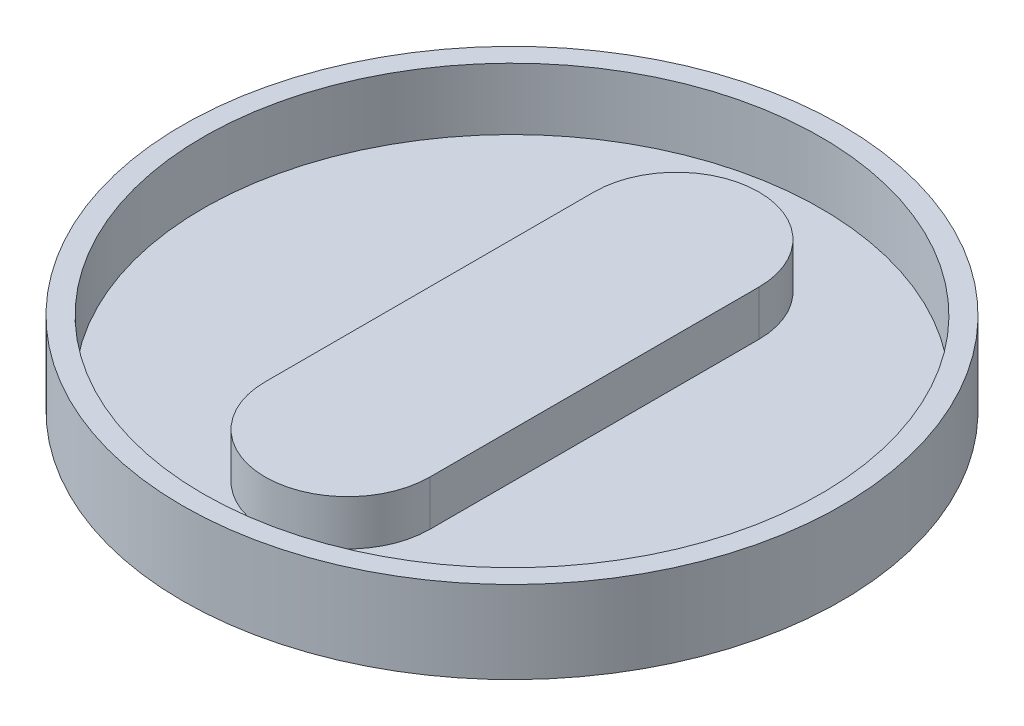
ISO-10303-21;
HEADER;
FILE_DESCRIPTION(('STEP AP214'),'2;1');
FILE_NAME('part.step','',(''),(''),'','','');
FILE_SCHEMA(('AUTOMOTIVE_DESIGN { 1 0 10303 214 1 1 1 1 }'));
ENDSEC;
DATA;
#1=APPLICATION_CONTEXT('core data for automotive mechanical design processes');
#2=APPLICATION_PROTOCOL_DEFINITION('international standard','automotive_design',2000,#1);
#3=PRODUCT_CONTEXT('',#1,'mechanical');
#4=PRODUCT('Part','Part','',(#3));
#5=PRODUCT_RELATED_PRODUCT_CATEGORY('part','',(#4));
#6=PRODUCT_DEFINITION_FORMATION('','',#4);
#7=PRODUCT_DEFINITION_CONTEXT('part definition',#1,'design');
#8=PRODUCT_DEFINITION('design','',#6,#7);
#9=PRODUCT_DEFINITION_SHAPE('','',#8);
#10=(LENGTH_UNIT() NAMED_UNIT(*) SI_UNIT(.MILLI.,.METRE.));
#11=(NAMED_UNIT(*) PLANE_ANGLE_UNIT() SI_UNIT($,.RADIAN.));
#12=(NAMED_UNIT(*) SI_UNIT($,.STERADIAN.) SOLID_ANGLE_UNIT());
#13=UNCERTAINTY_MEASURE_WITH_UNIT(LENGTH_MEASURE(1.E-05),#10,'distance_accuracy_value','');
#14=(GEOMETRIC_REPRESENTATION_CONTEXT(3) GLOBAL_UNCERTAINTY_ASSIGNED_CONTEXT((#13)) GLOBAL_UNIT_ASSIGNED_CONTEXT((#10,
#11,#12)) REPRESENTATION_CONTEXT('',''));
#15=CARTESIAN_POINT('',(0.,0.,0.));
#16=DIRECTION('',(0.,0.,1.));
#17=DIRECTION('',(1.,0.,0.));
#18=AXIS2_PLACEMENT_3D('',#15,#16,#17);
#19=CARTESIAN_POINT('',(0.,6.35,0.));
#20=DIRECTION('',(0.,1.,0.));
#21=DIRECTION('',(0.,0.,1.));
#22=AXIS2_PLACEMENT_3D('',#19,#20,#21);
#23=PLANE('',#22);
#24=CARTESIAN_POINT('',(0.,6.35,0.));
#25=DIRECTION('',(0.,1.,0.));
#26=DIRECTION('',(0.,0.,1.));
#27=AXIS2_PLACEMENT_3D('',#24,#25,#26);
#28=CIRCLE('',#27,95.25);
#29=CARTESIAN_POINT('',(0.,6.35,95.25));
#30=VERTEX_POINT('',#29);
#31=EDGE_CURVE('E114',#30,#30,#28,.T.);
#32=ORIENTED_EDGE('',*,*,#31,.T.);
#33=EDGE_LOOP('',(#32));
#34=FACE_BOUND('',#33,.T.);
#35=DIRECTION('',(0.,0.,-1.));
#36=VECTOR('',#35,1.);
#37=CARTESIAN_POINT('',(25.4,6.35,50.7079398741531));
#38=LINE('',#37,#36);
#39=CARTESIAN_POINT('',(25.4,6.35,50.7079398741531));
#40=VERTEX_POINT('',#39);
#41=CARTESIAN_POINT('',(25.4,6.35,-50.7079398741531));
#42=VERTEX_POINT('',#41);
#43=EDGE_CURVE('E92',#40,#42,#38,.T.);
#44=ORIENTED_EDGE('',*,*,#43,.F.);
#45=CARTESIAN_POINT('',(0.,6.35,50.7079398741531));
#46=DIRECTION('',(0.,1.,0.));
#47=DIRECTION('',(0.,0.,1.));
#48=AXIS2_PLACEMENT_3D('',#45,#46,#47);
#49=CIRCLE('',#48,25.4);
#50=CARTESIAN_POINT('',(-25.4,6.35,50.7079398741531));
#51=VERTEX_POINT('',#50);
#52=EDGE_CURVE('E103',#51,#40,#49,.T.);
#53=ORIENTED_EDGE('',*,*,#52,.F.);
#54=DIRECTION('',(0.,0.,1.));
#55=VECTOR('',#54,1.);
#56=CARTESIAN_POINT('',(-25.4,6.35,50.7079398741531));
#57=LINE('',#56,#55);
#58=CARTESIAN_POINT('',(-25.4,6.35,-50.7079398741531));
#59=VERTEX_POINT('',#58);
#60=EDGE_CURVE('E73',#59,#51,#57,.T.);
#61=ORIENTED_EDGE('',*,*,#60,.F.);
#62=CARTESIAN_POINT('',(0.,6.35,-50.7079398741531));
#63=DIRECTION('',(0.,1.,0.));
#64=DIRECTION('',(0.,0.,1.));
#65=AXIS2_PLACEMENT_3D('',#62,#63,#64);
#66=CIRCLE('',#65,25.4);
#67=EDGE_CURVE('E107',#42,#59,#66,.T.);
#68=ORIENTED_EDGE('',*,*,#67,.F.);
#69=EDGE_LOOP('',(#44,#53,#61,#68));
#70=FACE_BOUND('',#69,.T.);
#71=ADVANCED_FACE('F36',(#34,#70),#23,.T.);
#72=CARTESIAN_POINT('',(0.,25.4,0.));
#73=DIRECTION('',(0.,-1.,0.));
#74=DIRECTION('',(0.,0.,-1.));
#75=AXIS2_PLACEMENT_3D('',#72,#73,#74);
#76=CYLINDRICAL_SURFACE('',#75,101.6);
#77=CARTESIAN_POINT('',(0.,25.4,0.));
#78=DIRECTION('',(0.,1.,0.));
#79=DIRECTION('',(0.,0.,1.));
#80=AXIS2_PLACEMENT_3D('',#77,#78,#79);
#81=CIRCLE('',#80,101.6);
#82=CARTESIAN_POINT('',(0.,25.4,101.6));
#83=VERTEX_POINT('',#82);
#84=EDGE_CURVE('E11',#83,#83,#81,.T.);
#85=ORIENTED_EDGE('',*,*,#84,.F.);
#86=EDGE_LOOP('',(#85));
#87=FACE_BOUND('',#86,.T.);
#88=CARTESIAN_POINT('',(0.,0.,0.));
#89=DIRECTION('',(0.,1.,0.));
#90=DIRECTION('',(0.,0.,1.));
#91=AXIS2_PLACEMENT_3D('',#88,#89,#90);
#92=CIRCLE('',#91,101.6);
#93=CARTESIAN_POINT('',(0.,0.,101.6));
#94=VERTEX_POINT('',#93);
#95=EDGE_CURVE('E40',#94,#94,#92,.T.);
#96=ORIENTED_EDGE('',*,*,#95,.T.);
#97=EDGE_LOOP('',(#96));
#98=FACE_BOUND('',#97,.T.);
#99=ADVANCED_FACE('F38',(#87,#98),#76,.T.);
#100=CARTESIAN_POINT('',(0.,25.4,0.));
#101=DIRECTION('',(0.,1.,0.));
#102=DIRECTION('',(0.,0.,1.));
#103=AXIS2_PLACEMENT_3D('',#100,#101,#102);
#104=PLANE('',#103);
#105=CARTESIAN_POINT('',(0.,25.4,0.));
#106=DIRECTION('',(0.,1.,0.));
#107=DIRECTION('',(0.,0.,1.));
#108=AXIS2_PLACEMENT_3D('',#105,#106,#107);
#109=CIRCLE('',#108,95.25);
#110=CARTESIAN_POINT('',(0.,25.4,95.25));
#111=VERTEX_POINT('',#110);
#112=EDGE_CURVE('E113',#111,#111,#109,.T.);
#113=ORIENTED_EDGE('',*,*,#112,.F.);
#114=EDGE_LOOP('',(#113));
#115=FACE_BOUND('',#114,.T.);
#116=ORIENTED_EDGE('',*,*,#84,.T.);
#117=EDGE_LOOP('',(#116));
#118=FACE_BOUND('',#117,.T.);
#119=ADVANCED_FACE('F122',(#115,#118),#104,.T.);
#120=CARTESIAN_POINT('',(0.,0.,0.));
#121=DIRECTION('',(0.,1.,0.));
#122=DIRECTION('',(0.,0.,1.));
#123=AXIS2_PLACEMENT_3D('',#120,#121,#122);
#124=PLANE('',#123);
#125=ORIENTED_EDGE('',*,*,#95,.F.);
#126=EDGE_LOOP('',(#125));
#127=FACE_BOUND('',#126,.T.);
#128=ADVANCED_FACE('F125',(#127),#124,.F.);
#129=CARTESIAN_POINT('',(0.,6.35,0.));
#130=DIRECTION('',(0.,1.,0.));
#131=DIRECTION('',(0.,0.,1.));
#132=AXIS2_PLACEMENT_3D('',#129,#130,#131);
#133=CYLINDRICAL_SURFACE('',#132,95.25);
#134=CARTESIAN_POINT('',(0.,6.35,95.25));
#135=CARTESIAN_POINT('',(0.,6.5484375,95.25));
#136=CARTESIAN_POINT('',(0.,6.746875,95.25));
#137=CARTESIAN_POINT('',(0.,7.14375,95.25));
#138=CARTESIAN_POINT('',(0.,7.3421875,95.25));
#139=CARTESIAN_POINT('',(0.,7.7390625,95.25));
#140=CARTESIAN_POINT('',(0.,7.9375,95.25));
#141=CARTESIAN_POINT('',(0.,8.334375,95.25));
#142=CARTESIAN_POINT('',(0.,8.5328125,95.25));
#143=CARTESIAN_POINT('',(0.,8.9296875,95.25));
#144=CARTESIAN_POINT('',(0.,9.128125,95.25));
#145=CARTESIAN_POINT('',(0.,9.525,95.25));
#146=CARTESIAN_POINT('',(0.,9.7234375,95.25));
#147=CARTESIAN_POINT('',(0.,10.1203125,95.25));
#148=CARTESIAN_POINT('',(0.,10.31875,95.25));
#149=CARTESIAN_POINT('',(0.,10.715625,95.25));
#150=CARTESIAN_POINT('',(0.,10.9140625,95.25));
#151=CARTESIAN_POINT('',(0.,11.3109375,95.25));
#152=CARTESIAN_POINT('',(0.,11.509375,95.25));
#153=CARTESIAN_POINT('',(0.,11.90625,95.25));
#154=CARTESIAN_POINT('',(0.,12.1046875,95.25));
#155=CARTESIAN_POINT('',(0.,12.5015625,95.25));
#156=CARTESIAN_POINT('',(0.,12.7,95.25));
#157=CARTESIAN_POINT('',(0.,13.096875,95.25));
#158=CARTESIAN_POINT('',(0.,13.2953125,95.25));
#159=CARTESIAN_POINT('',(0.,13.6921875,95.25));
#160=CARTESIAN_POINT('',(0.,13.890625,95.25));
#161=CARTESIAN_POINT('',(0.,14.2875,95.25));
#162=CARTESIAN_POINT('',(0.,14.4859375,95.25));
#163=CARTESIAN_POINT('',(0.,14.8828125,95.25));
#164=CARTESIAN_POINT('',(0.,15.08125,95.25));
#165=CARTESIAN_POINT('',(0.,15.478125,95.25));
#166=CARTESIAN_POINT('',(0.,15.6765625,95.25));
#167=CARTESIAN_POINT('',(0.,16.0734375,95.25));
#168=CARTESIAN_POINT('',(0.,16.271875,95.25));
#169=CARTESIAN_POINT('',(0.,16.66875,95.25));
#170=CARTESIAN_POINT('',(0.,16.8671875,95.25));
#171=CARTESIAN_POINT('',(0.,17.2640625,95.25));
#172=CARTESIAN_POINT('',(0.,17.4625,95.25));
#173=CARTESIAN_POINT('',(0.,17.859375,95.25));
#174=CARTESIAN_POINT('',(0.,18.0578125,95.25));
#175=CARTESIAN_POINT('',(0.,18.4546875,95.25));
#176=CARTESIAN_POINT('',(0.,18.653125,95.25));
#177=CARTESIAN_POINT('',(0.,19.05,95.25));
#178=CARTESIAN_POINT('',(0.,19.2484375,95.25));
#179=CARTESIAN_POINT('',(0.,19.6453125,95.25));
#180=CARTESIAN_POINT('',(0.,19.84375,95.25));
#181=CARTESIAN_POINT('',(0.,20.240625,95.25));
#182=CARTESIAN_POINT('',(0.,20.4390625,95.25));
#183=CARTESIAN_POINT('',(0.,20.8359375,95.25));
#184=CARTESIAN_POINT('',(0.,21.034375,95.25));
#185=CARTESIAN_POINT('',(0.,21.43125,95.25));
#186=CARTESIAN_POINT('',(0.,21.6296875,95.25));
#187=CARTESIAN_POINT('',(0.,22.0265625,95.25));
#188=CARTESIAN_POINT('',(0.,22.225,95.25));
#189=CARTESIAN_POINT('',(0.,22.621875,95.25));
#190=CARTESIAN_POINT('',(0.,22.8203125,95.25));
#191=CARTESIAN_POINT('',(0.,23.2171875,95.25));
#192=CARTESIAN_POINT('',(0.,23.415625,95.25));
#193=CARTESIAN_POINT('',(0.,23.8125,95.25));
#194=CARTESIAN_POINT('',(0.,24.0109375,95.25));
#195=CARTESIAN_POINT('',(0.,24.4078125,95.25));
#196=CARTESIAN_POINT('',(0.,24.60625,95.25));
#197=CARTESIAN_POINT('',(0.,25.003125,95.25));
#198=CARTESIAN_POINT('',(0.,25.2015625,95.25));
#199=CARTESIAN_POINT('',(0.,25.4,95.25));
#200=B_SPLINE_CURVE_WITH_KNOTS('',3,(#134,#135,#136,#137,#138,#139,#140,#141,#142,#143,#144,
#145,#146,#147,#148,#149,#150,#151,#152,#153,#154,#155,#156,#157,#158,#159,#160,#161,#162,#163,
#164,#165,#166,#167,#168,#169,#170,#171,#172,#173,#174,#175,#176,#177,#178,#179,#180,#181,#182,
#183,#184,#185,#186,#187,#188,#189,#190,#191,#192,#193,#194,#195,#196,#197,#198,#199),
.UNSPECIFIED.,.F.,.F.,(4,2,2,2,2,2,2,2,2,2,2,2,2,2,2,2,2,2,2,2,2,2,2,2,2,2,2,2,2,2,2,2,4),(0.,
0.595312499999999,1.190625,1.7859375,2.38125,2.9765625,3.571875,4.1671875,4.7625,5.3578125,
5.953125,6.5484375,7.14375,7.7390625,8.334375,8.9296875,9.525,10.1203125,10.715625,11.3109375,
11.90625,12.5015625,13.096875,13.6921875,14.2875,14.8828125,15.478125,16.0734375,16.66875,
17.2640625,17.859375,18.4546875,19.05),.UNSPECIFIED.);
#201=EDGE_CURVE('BSEAM120',#30,#111,#200,.T.);
#202=ORIENTED_EDGE('',*,*,#31,.F.);
#203=ORIENTED_EDGE('',*,*,#112,.T.);
#204=ORIENTED_EDGE('',*,*,#201,.T.);
#205=ORIENTED_EDGE('',*,*,#201,.F.);
#206=EDGE_LOOP('',(#202,#204,#203,#205));
#207=FACE_BOUND('',#206,.T.);
#208=ADVANCED_FACE('F120',(#207),#133,.F.);
#209=CARTESIAN_POINT('',(0.,20.32,50.7079398741531));
#210=DIRECTION('',(0.,-1.,0.));
#211=DIRECTION('',(0.,0.,-1.));
#212=AXIS2_PLACEMENT_3D('',#209,#210,#211);
#213=CYLINDRICAL_SURFACE('',#212,25.4);
#214=ORIENTED_EDGE('',*,*,#52,.T.);
#215=DIRECTION('',(0.,-1.,0.));
#216=VECTOR('',#215,1.);
#217=CARTESIAN_POINT('',(25.4,20.32,50.7079398741531));
#218=LINE('',#217,#216);
#219=CARTESIAN_POINT('',(25.4,20.32,50.7079398741531));
#220=VERTEX_POINT('',#219);
#221=EDGE_CURVE('E95',#220,#40,#218,.T.);
#222=ORIENTED_EDGE('',*,*,#221,.F.);
#223=CARTESIAN_POINT('',(0.,20.32,50.7079398741531));
#224=DIRECTION('',(0.,1.,0.));
#225=DIRECTION('',(0.,0.,1.));
#226=AXIS2_PLACEMENT_3D('',#223,#224,#225);
#227=CIRCLE('',#226,25.4);
#228=CARTESIAN_POINT('',(-25.4,20.32,50.7079398741531));
#229=VERTEX_POINT('',#228);
#230=EDGE_CURVE('E85',#229,#220,#227,.T.);
#231=ORIENTED_EDGE('',*,*,#230,.F.);
#232=DIRECTION('',(0.,-1.,0.));
#233=VECTOR('',#232,1.);
#234=CARTESIAN_POINT('',(-25.4,20.32,50.7079398741531));
#235=LINE('',#234,#233);
#236=EDGE_CURVE('E99',#229,#51,#235,.T.);
#237=ORIENTED_EDGE('',*,*,#236,.T.);
#238=EDGE_LOOP('',(#214,#222,#231,#237));
#239=FACE_BOUND('',#238,.T.);
#240=ADVANCED_FACE('F138',(#239),#213,.T.);
#241=CARTESIAN_POINT('',(25.4,20.32,50.7079398741531));
#242=DIRECTION('',(-1.,0.,0.));
#243=DIRECTION('',(0.,0.,1.));
#244=AXIS2_PLACEMENT_3D('',#241,#242,#243);
#245=PLANE('',#244);
#246=ORIENTED_EDGE('',*,*,#43,.T.);
#247=DIRECTION('',(0.,-1.,0.));
#248=VECTOR('',#247,1.);
#249=CARTESIAN_POINT('',(25.4,20.32,-50.7079398741531));
#250=LINE('',#249,#248);
#251=CARTESIAN_POINT('',(25.4,20.32,-50.7079398741531));
#252=VERTEX_POINT('',#251);
#253=EDGE_CURVE('E89',#252,#42,#250,.T.);
#254=ORIENTED_EDGE('',*,*,#253,.F.);
#255=DIRECTION('',(0.,0.,-1.));
#256=VECTOR('',#255,1.);
#257=CARTESIAN_POINT('',(25.4,20.32,50.7079398741531));
#258=LINE('',#257,#256);
#259=EDGE_CURVE('E80',#220,#252,#258,.T.);
#260=ORIENTED_EDGE('',*,*,#259,.F.);
#261=ORIENTED_EDGE('',*,*,#221,.T.);
#262=EDGE_LOOP('',(#246,#254,#260,#261));
#263=FACE_BOUND('',#262,.T.);
#264=ADVANCED_FACE('F90',(#263),#245,.F.);
#265=CARTESIAN_POINT('',(0.,20.32,-50.7079398741531));
#266=DIRECTION('',(0.,-1.,0.));
#267=DIRECTION('',(0.,0.,-1.));
#268=AXIS2_PLACEMENT_3D('',#265,#266,#267);
#269=CYLINDRICAL_SURFACE('',#268,25.4);
#270=ORIENTED_EDGE('',*,*,#67,.T.);
#271=DIRECTION('',(0.,-1.,0.));
#272=VECTOR('',#271,1.);
#273=CARTESIAN_POINT('',(-25.4,20.32,-50.7079398741531));
#274=LINE('',#273,#272);
#275=CARTESIAN_POINT('',(-25.4,20.32,-50.7079398741531));
#276=VERTEX_POINT('',#275);
#277=EDGE_CURVE('E51',#276,#59,#274,.T.);
#278=ORIENTED_EDGE('',*,*,#277,.F.);
#279=CARTESIAN_POINT('',(0.,20.32,-50.7079398741531));
#280=DIRECTION('',(0.,1.,0.));
#281=DIRECTION('',(0.,0.,1.));
#282=AXIS2_PLACEMENT_3D('',#279,#280,#281);
#283=CIRCLE('',#282,25.4);
#284=EDGE_CURVE('E83',#252,#276,#283,.T.);
#285=ORIENTED_EDGE('',*,*,#284,.F.);
#286=ORIENTED_EDGE('',*,*,#253,.T.);
#287=EDGE_LOOP('',(#270,#278,#285,#286));
#288=FACE_BOUND('',#287,.T.);
#289=ADVANCED_FACE('F97',(#288),#269,.T.);
#290=CARTESIAN_POINT('',(-25.4,20.32,50.7079398741531));
#291=DIRECTION('',(1.,0.,0.));
#292=DIRECTION('',(0.,0.,-1.));
#293=AXIS2_PLACEMENT_3D('',#290,#291,#292);
#294=PLANE('',#293);
#295=ORIENTED_EDGE('',*,*,#60,.T.);
#296=ORIENTED_EDGE('',*,*,#236,.F.);
#297=DIRECTION('',(0.,0.,1.));
#298=VECTOR('',#297,1.);
#299=CARTESIAN_POINT('',(-25.4,20.32,50.7079398741531));
#300=LINE('',#299,#298);
#301=EDGE_CURVE('E59',#276,#229,#300,.T.);
#302=ORIENTED_EDGE('',*,*,#301,.F.);
#303=ORIENTED_EDGE('',*,*,#277,.T.);
#304=EDGE_LOOP('',(#295,#296,#302,#303));
#305=FACE_BOUND('',#304,.T.);
#306=ADVANCED_FACE('F155',(#305),#294,.F.);
#307=CARTESIAN_POINT('',(0.,20.32,50.7079398741531));
#308=DIRECTION('',(0.,1.,0.));
#309=DIRECTION('',(0.,0.,1.));
#310=AXIS2_PLACEMENT_3D('',#307,#308,#309);
#311=PLANE('',#310);
#312=ORIENTED_EDGE('',*,*,#230,.T.);
#313=ORIENTED_EDGE('',*,*,#259,.T.);
#314=ORIENTED_EDGE('',*,*,#284,.T.);
#315=ORIENTED_EDGE('',*,*,#301,.T.);
#316=EDGE_LOOP('',(#312,#313,#314,#315));
#317=FACE_BOUND('',#316,.T.);
#318=ADVANCED_FACE('F81',(#317),#311,.T.);
#319=CLOSED_SHELL('',(#71,#99,#119,#128,#208,#240,#264,#289,#306,#318));
#320=MANIFOLD_SOLID_BREP('B2',#319);
#321=ADVANCED_BREP_SHAPE_REPRESENTATION('',(#18,#320),#14);
#322=SHAPE_DEFINITION_REPRESENTATION(#9,#321);
ENDSEC;
END-ISO-10303-21;
